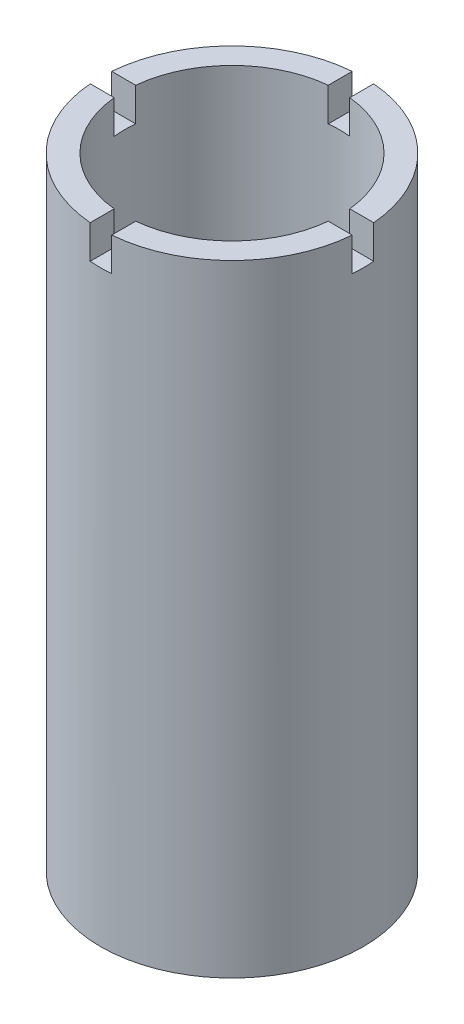
ISO-10303-21;
HEADER;
FILE_DESCRIPTION(('STEP AP214'),'2;1');
FILE_NAME('part.step','',(''),(''),'','','');
FILE_SCHEMA(('AUTOMOTIVE_DESIGN { 1 0 10303 214 1 1 1 1 }'));
ENDSEC;
DATA;
#1=APPLICATION_CONTEXT('core data for automotive mechanical design processes');
#2=APPLICATION_PROTOCOL_DEFINITION('international standard','automotive_design',2000,#1);
#3=PRODUCT_CONTEXT('',#1,'mechanical');
#4=PRODUCT('Part','Part','',(#3));
#5=PRODUCT_RELATED_PRODUCT_CATEGORY('part','',(#4));
#6=PRODUCT_DEFINITION_FORMATION('','',#4);
#7=PRODUCT_DEFINITION_CONTEXT('part definition',#1,'design');
#8=PRODUCT_DEFINITION('design','',#6,#7);
#9=PRODUCT_DEFINITION_SHAPE('','',#8);
#10=(LENGTH_UNIT() NAMED_UNIT(*) SI_UNIT(.MILLI.,.METRE.));
#11=(NAMED_UNIT(*) PLANE_ANGLE_UNIT() SI_UNIT($,.RADIAN.));
#12=(NAMED_UNIT(*) SI_UNIT($,.STERADIAN.) SOLID_ANGLE_UNIT());
#13=UNCERTAINTY_MEASURE_WITH_UNIT(LENGTH_MEASURE(1.E-05),#10,'distance_accuracy_value','');
#14=(GEOMETRIC_REPRESENTATION_CONTEXT(3) GLOBAL_UNCERTAINTY_ASSIGNED_CONTEXT((#13)) GLOBAL_UNIT_ASSIGNED_CONTEXT((#10,
#11,#12)) REPRESENTATION_CONTEXT('',''));
#15=CARTESIAN_POINT('',(0.,0.,0.));
#16=DIRECTION('',(0.,0.,1.));
#17=DIRECTION('',(1.,0.,0.));
#18=AXIS2_PLACEMENT_3D('',#15,#16,#17);
#19=CARTESIAN_POINT('',(0.,130.,0.));
#20=DIRECTION('',(0.,1.,0.));
#21=DIRECTION('',(0.,0.,1.));
#22=AXIS2_PLACEMENT_3D('',#19,#20,#21);
#23=PLANE('',#22);
#24=DIRECTION('',(1.,0.,-3.47163573248831E-13));
#25=VECTOR('',#24,1.);
#26=CARTESIAN_POINT('',(27.4077999846761,130.,2.24999999999811));
#27=LINE('',#26,#25);
#28=CARTESIAN_POINT('',(22.387217334899,130.,2.24999999999985));
#29=VERTEX_POINT('',#28);
#30=CARTESIAN_POINT('',(27.4077999846761,130.,2.24999999999811));
#31=VERTEX_POINT('',#30);
#32=EDGE_CURVE('E173',#29,#31,#27,.T.);
#33=ORIENTED_EDGE('',*,*,#32,.F.);
#34=CARTESIAN_POINT('',(0.,130.,0.));
#35=DIRECTION('',(0.,1.,0.));
#36=DIRECTION('',(0.,0.,1.));
#37=AXIS2_PLACEMENT_3D('',#34,#35,#36);
#38=CIRCLE('',#37,22.5);
#39=CARTESIAN_POINT('',(2.25,130.,22.387217334899));
#40=VERTEX_POINT('',#39);
#41=EDGE_CURVE('E255',#40,#29,#38,.T.);
#42=ORIENTED_EDGE('',*,*,#41,.F.);
#43=DIRECTION('',(0.,0.,-1.));
#44=VECTOR('',#43,1.);
#45=CARTESIAN_POINT('',(2.25,130.,27.4077999846759));
#46=LINE('',#45,#44);
#47=CARTESIAN_POINT('',(2.25,130.,27.4077999846759));
#48=VERTEX_POINT('',#47);
#49=EDGE_CURVE('E196',#48,#40,#46,.T.);
#50=ORIENTED_EDGE('',*,*,#49,.F.);
#51=CARTESIAN_POINT('',(0.,130.,0.));
#52=DIRECTION('',(0.,1.,0.));
#53=DIRECTION('',(0.,0.,1.));
#54=AXIS2_PLACEMENT_3D('',#51,#52,#53);
#55=CIRCLE('',#54,27.5);
#56=EDGE_CURVE('E12',#48,#31,#55,.T.);
#57=ORIENTED_EDGE('',*,*,#56,.T.);
#58=EDGE_LOOP('',(#33,#42,#50,#57));
#59=FACE_BOUND('',#58,.T.);
#60=ADVANCED_FACE('F42',(#59),#23,.T.);
#61=DIRECTION('',(-1.,0.,0.));
#62=VECTOR('',#61,1.);
#63=CARTESIAN_POINT('',(27.4077999846759,130.,-2.25000000000018));
#64=LINE('',#63,#62);
#65=CARTESIAN_POINT('',(27.4077999846759,130.,-2.25000000000018));
#66=VERTEX_POINT('',#65);
#67=CARTESIAN_POINT('',(22.3872173348989,130.,-2.25000000000014));
#68=VERTEX_POINT('',#67);
#69=EDGE_CURVE('E201',#66,#68,#64,.T.);
#70=ORIENTED_EDGE('',*,*,#69,.F.);
#71=CARTESIAN_POINT('',(2.25,130.,-27.4077999846759));
#72=VERTEX_POINT('',#71);
#73=EDGE_CURVE('E51',#66,#72,#55,.T.);
#74=ORIENTED_EDGE('',*,*,#73,.T.);
#75=DIRECTION('',(0.,0.,-1.));
#76=VECTOR('',#75,1.);
#77=CARTESIAN_POINT('',(2.25,130.,-27.4077999846759));
#78=LINE('',#77,#76);
#79=CARTESIAN_POINT('',(2.25,130.,-22.387217334899));
#80=VERTEX_POINT('',#79);
#81=EDGE_CURVE('E195',#80,#72,#78,.T.);
#82=ORIENTED_EDGE('',*,*,#81,.F.);
#83=EDGE_CURVE('E258',#68,#80,#38,.T.);
#84=ORIENTED_EDGE('',*,*,#83,.F.);
#85=EDGE_LOOP('',(#70,#74,#82,#84));
#86=FACE_BOUND('',#85,.T.);
#87=ADVANCED_FACE('F313',(#86),#23,.T.);
#88=DIRECTION('',(0.,0.,1.));
#89=VECTOR('',#88,1.);
#90=CARTESIAN_POINT('',(-2.25,130.,-27.4077999846759));
#91=LINE('',#90,#89);
#92=CARTESIAN_POINT('',(-2.25,130.,-27.4077999846759));
#93=VERTEX_POINT('',#92);
#94=CARTESIAN_POINT('',(-2.25,130.,-22.387217334899));
#95=VERTEX_POINT('',#94);
#96=EDGE_CURVE('E220',#93,#95,#91,.T.);
#97=ORIENTED_EDGE('',*,*,#96,.F.);
#98=CARTESIAN_POINT('',(-27.4077999846759,130.,-2.25));
#99=VERTEX_POINT('',#98);
#100=EDGE_CURVE('E299',#93,#99,#55,.T.);
#101=ORIENTED_EDGE('',*,*,#100,.T.);
#102=DIRECTION('',(-1.,0.,0.));
#103=VECTOR('',#102,1.);
#104=CARTESIAN_POINT('',(-27.4077999846759,130.,-2.25));
#105=LINE('',#104,#103);
#106=CARTESIAN_POINT('',(-22.387217334899,130.,-2.25));
#107=VERTEX_POINT('',#106);
#108=EDGE_CURVE('E219',#107,#99,#105,.T.);
#109=ORIENTED_EDGE('',*,*,#108,.F.);
#110=EDGE_CURVE('E266',#95,#107,#38,.T.);
#111=ORIENTED_EDGE('',*,*,#110,.F.);
#112=EDGE_LOOP('',(#97,#101,#109,#111));
#113=FACE_BOUND('',#112,.T.);
#114=ADVANCED_FACE('F310',(#113),#23,.T.);
#115=DIRECTION('',(0.,0.,1.));
#116=VECTOR('',#115,1.);
#117=CARTESIAN_POINT('',(-2.25,130.,27.4077999846759));
#118=LINE('',#117,#116);
#119=CARTESIAN_POINT('',(-2.25,130.,22.387217334899));
#120=VERTEX_POINT('',#119);
#121=CARTESIAN_POINT('',(-2.25,130.,27.4077999846759));
#122=VERTEX_POINT('',#121);
#123=EDGE_CURVE('E198',#120,#122,#118,.T.);
#124=ORIENTED_EDGE('',*,*,#123,.F.);
#125=CARTESIAN_POINT('',(-22.387217334899,130.,2.25));
#126=VERTEX_POINT('',#125);
#127=EDGE_CURVE('E259',#126,#120,#38,.T.);
#128=ORIENTED_EDGE('',*,*,#127,.F.);
#129=DIRECTION('',(1.,0.,0.));
#130=VECTOR('',#129,1.);
#131=CARTESIAN_POINT('',(-27.4077999846759,130.,2.25));
#132=LINE('',#131,#130);
#133=CARTESIAN_POINT('',(-27.4077999846759,130.,2.25));
#134=VERTEX_POINT('',#133);
#135=EDGE_CURVE('E243',#134,#126,#132,.T.);
#136=ORIENTED_EDGE('',*,*,#135,.F.);
#137=EDGE_CURVE('E52',#134,#122,#55,.T.);
#138=ORIENTED_EDGE('',*,*,#137,.T.);
#139=EDGE_LOOP('',(#124,#128,#136,#138));
#140=FACE_BOUND('',#139,.T.);
#141=ADVANCED_FACE('F297',(#140),#23,.T.);
#142=CARTESIAN_POINT('',(0.,0.,0.));
#143=DIRECTION('',(0.,1.,0.));
#144=DIRECTION('',(0.,0.,1.));
#145=AXIS2_PLACEMENT_3D('',#142,#143,#144);
#146=PLANE('',#145);
#147=CARTESIAN_POINT('',(0.,0.,0.));
#148=DIRECTION('',(0.,1.,0.));
#149=DIRECTION('',(0.,0.,1.));
#150=AXIS2_PLACEMENT_3D('',#147,#148,#149);
#151=CIRCLE('',#150,27.5);
#152=CARTESIAN_POINT('',(0.,0.,27.5));
#153=VERTEX_POINT('',#152);
#154=EDGE_CURVE('E46',#153,#153,#151,.T.);
#155=ORIENTED_EDGE('',*,*,#154,.F.);
#156=EDGE_LOOP('',(#155));
#157=FACE_BOUND('',#156,.T.);
#158=CARTESIAN_POINT('',(0.,0.,0.));
#159=DIRECTION('',(0.,1.,0.));
#160=DIRECTION('',(0.,0.,1.));
#161=AXIS2_PLACEMENT_3D('',#158,#159,#160);
#162=CIRCLE('',#161,22.5);
#163=CARTESIAN_POINT('',(0.,0.,22.5));
#164=VERTEX_POINT('',#163);
#165=EDGE_CURVE('E260',#164,#164,#162,.T.);
#166=ORIENTED_EDGE('',*,*,#165,.T.);
#167=EDGE_LOOP('',(#166));
#168=FACE_BOUND('',#167,.T.);
#169=ADVANCED_FACE('F304',(#157,#168),#146,.F.);
#170=CARTESIAN_POINT('',(0.,130.,0.));
#171=DIRECTION('',(0.,-1.,0.));
#172=DIRECTION('',(0.,0.,-1.));
#173=AXIS2_PLACEMENT_3D('',#170,#171,#172);
#174=CYLINDRICAL_SURFACE('',#173,27.5);
#175=CARTESIAN_POINT('',(0.,123.,0.));
#176=DIRECTION('',(0.,1.,0.));
#177=DIRECTION('',(0.,0.,1.));
#178=AXIS2_PLACEMENT_3D('',#175,#176,#177);
#179=CIRCLE('',#178,27.5);
#180=CARTESIAN_POINT('',(27.4077999846761,123.,2.24999999999811));
#181=VERTEX_POINT('',#180);
#182=CARTESIAN_POINT('',(27.4077999846759,123.,-2.25000000000018));
#183=VERTEX_POINT('',#182);
#184=EDGE_CURVE('E164',#181,#183,#179,.T.);
#185=ORIENTED_EDGE('',*,*,#184,.F.);
#186=DIRECTION('',(0.,1.,0.));
#187=VECTOR('',#186,1.);
#188=CARTESIAN_POINT('',(27.4077999846761,123.,2.24999999999811));
#189=LINE('',#188,#187);
#190=EDGE_CURVE('E262',#181,#31,#189,.T.);
#191=ORIENTED_EDGE('',*,*,#190,.T.);
#192=ORIENTED_EDGE('',*,*,#56,.F.);
#193=DIRECTION('',(0.,1.,0.));
#194=VECTOR('',#193,1.);
#195=CARTESIAN_POINT('',(2.25,123.,27.4077999846759));
#196=LINE('',#195,#194);
#197=CARTESIAN_POINT('',(2.25,123.,27.4077999846759));
#198=VERTEX_POINT('',#197);
#199=EDGE_CURVE('E190',#198,#48,#196,.T.);
#200=ORIENTED_EDGE('',*,*,#199,.F.);
#201=CARTESIAN_POINT('',(0.,123.,0.));
#202=DIRECTION('',(0.,1.,0.));
#203=DIRECTION('',(0.,0.,1.));
#204=AXIS2_PLACEMENT_3D('',#201,#202,#203);
#205=CIRCLE('',#204,27.5);
#206=CARTESIAN_POINT('',(-2.25,123.,27.4077999846759));
#207=VERTEX_POINT('',#206);
#208=EDGE_CURVE('E203',#207,#198,#205,.T.);
#209=ORIENTED_EDGE('',*,*,#208,.F.);
#210=DIRECTION('',(0.,1.,0.));
#211=VECTOR('',#210,1.);
#212=CARTESIAN_POINT('',(-2.25,123.,27.4077999846759));
#213=LINE('',#212,#211);
#214=EDGE_CURVE('E187',#207,#122,#213,.T.);
#215=ORIENTED_EDGE('',*,*,#214,.T.);
#216=ORIENTED_EDGE('',*,*,#137,.F.);
#217=DIRECTION('',(0.,1.,0.));
#218=VECTOR('',#217,1.);
#219=CARTESIAN_POINT('',(-27.4077999846759,123.,2.25));
#220=LINE('',#219,#218);
#221=CARTESIAN_POINT('',(-27.4077999846759,123.,2.25));
#222=VERTEX_POINT('',#221);
#223=EDGE_CURVE('E238',#222,#134,#220,.T.);
#224=ORIENTED_EDGE('',*,*,#223,.F.);
#225=CARTESIAN_POINT('',(0.,123.,0.));
#226=DIRECTION('',(0.,1.,0.));
#227=DIRECTION('',(0.,0.,1.));
#228=AXIS2_PLACEMENT_3D('',#225,#226,#227);
#229=CIRCLE('',#228,27.5);
#230=CARTESIAN_POINT('',(-27.4077999846759,123.,-2.25));
#231=VERTEX_POINT('',#230);
#232=EDGE_CURVE('E248',#231,#222,#229,.T.);
#233=ORIENTED_EDGE('',*,*,#232,.F.);
#234=DIRECTION('',(0.,1.,0.));
#235=VECTOR('',#234,1.);
#236=CARTESIAN_POINT('',(-27.4077999846759,123.,-2.25));
#237=LINE('',#236,#235);
#238=EDGE_CURVE('E235',#231,#99,#237,.T.);
#239=ORIENTED_EDGE('',*,*,#238,.T.);
#240=ORIENTED_EDGE('',*,*,#100,.F.);
#241=DIRECTION('',(0.,1.,0.));
#242=VECTOR('',#241,1.);
#243=CARTESIAN_POINT('',(-2.25,123.,-27.4077999846759));
#244=LINE('',#243,#242);
#245=CARTESIAN_POINT('',(-2.25,123.,-27.4077999846759));
#246=VERTEX_POINT('',#245);
#247=EDGE_CURVE('E214',#246,#93,#244,.T.);
#248=ORIENTED_EDGE('',*,*,#247,.F.);
#249=CARTESIAN_POINT('',(0.,123.,0.));
#250=DIRECTION('',(0.,1.,0.));
#251=DIRECTION('',(0.,0.,1.));
#252=AXIS2_PLACEMENT_3D('',#249,#250,#251);
#253=CIRCLE('',#252,27.5);
#254=CARTESIAN_POINT('',(2.25,123.,-27.4077999846759));
#255=VERTEX_POINT('',#254);
#256=EDGE_CURVE('E225',#255,#246,#253,.T.);
#257=ORIENTED_EDGE('',*,*,#256,.F.);
#258=DIRECTION('',(0.,1.,0.));
#259=VECTOR('',#258,1.);
#260=CARTESIAN_POINT('',(2.25,123.,-27.4077999846759));
#261=LINE('',#260,#259);
#262=EDGE_CURVE('E212',#255,#72,#261,.T.);
#263=ORIENTED_EDGE('',*,*,#262,.T.);
#264=ORIENTED_EDGE('',*,*,#73,.F.);
#265=DIRECTION('',(0.,1.,0.));
#266=VECTOR('',#265,1.);
#267=CARTESIAN_POINT('',(27.4077999846759,123.,-2.25000000000018));
#268=LINE('',#267,#266);
#269=EDGE_CURVE('E158',#183,#66,#268,.T.);
#270=ORIENTED_EDGE('',*,*,#269,.F.);
#271=EDGE_LOOP('',(#185,#191,#192,#200,#209,#215,#216,#224,#233,#239,#240,#248,#257,#263,#264,#270));
#272=FACE_BOUND('',#271,.T.);
#273=ORIENTED_EDGE('',*,*,#154,.T.);
#274=EDGE_LOOP('',(#273));
#275=FACE_BOUND('',#274,.T.);
#276=ADVANCED_FACE('F44',(#272,#275),#174,.T.);
#277=CARTESIAN_POINT('',(0.,130.,0.));
#278=DIRECTION('',(0.,-1.,0.));
#279=DIRECTION('',(0.,0.,-1.));
#280=AXIS2_PLACEMENT_3D('',#277,#278,#279);
#281=CYLINDRICAL_SURFACE('',#280,22.5);
#282=DIRECTION('',(0.,1.,0.));
#283=VECTOR('',#282,1.);
#284=CARTESIAN_POINT('',(22.387217334899,123.,2.24999999999985));
#285=LINE('',#284,#283);
#286=CARTESIAN_POINT('',(22.387217334899,123.,2.24999999999985));
#287=VERTEX_POINT('',#286);
#288=EDGE_CURVE('E180',#287,#29,#285,.T.);
#289=ORIENTED_EDGE('',*,*,#288,.F.);
#290=CARTESIAN_POINT('',(0.,123.,0.));
#291=DIRECTION('',(0.,-1.,0.));
#292=DIRECTION('',(0.,0.,1.));
#293=AXIS2_PLACEMENT_3D('',#290,#291,#292);
#294=CIRCLE('',#293,22.5);
#295=CARTESIAN_POINT('',(22.3872173348989,123.,-2.25000000000014));
#296=VERTEX_POINT('',#295);
#297=EDGE_CURVE('E163',#296,#287,#294,.T.);
#298=ORIENTED_EDGE('',*,*,#297,.F.);
#299=DIRECTION('',(0.,1.,0.));
#300=VECTOR('',#299,1.);
#301=CARTESIAN_POINT('',(22.3872173348989,123.,-2.25000000000014));
#302=LINE('',#301,#300);
#303=EDGE_CURVE('E161',#296,#68,#302,.T.);
#304=ORIENTED_EDGE('',*,*,#303,.T.);
#305=ORIENTED_EDGE('',*,*,#83,.T.);
#306=DIRECTION('',(0.,1.,0.));
#307=VECTOR('',#306,1.);
#308=CARTESIAN_POINT('',(2.25,123.,-22.387217334899));
#309=LINE('',#308,#307);
#310=CARTESIAN_POINT('',(2.25,123.,-22.387217334899));
#311=VERTEX_POINT('',#310);
#312=EDGE_CURVE('E209',#311,#80,#309,.T.);
#313=ORIENTED_EDGE('',*,*,#312,.F.);
#314=CARTESIAN_POINT('',(0.,123.,0.));
#315=DIRECTION('',(0.,-1.,0.));
#316=DIRECTION('',(0.,0.,1.));
#317=AXIS2_PLACEMENT_3D('',#314,#315,#316);
#318=CIRCLE('',#317,22.5);
#319=CARTESIAN_POINT('',(-2.25,123.,-22.387217334899));
#320=VERTEX_POINT('',#319);
#321=EDGE_CURVE('E222',#320,#311,#318,.T.);
#322=ORIENTED_EDGE('',*,*,#321,.F.);
#323=DIRECTION('',(0.,1.,0.));
#324=VECTOR('',#323,1.);
#325=CARTESIAN_POINT('',(-2.25,123.,-22.387217334899));
#326=LINE('',#325,#324);
#327=EDGE_CURVE('E216',#320,#95,#326,.T.);
#328=ORIENTED_EDGE('',*,*,#327,.T.);
#329=ORIENTED_EDGE('',*,*,#110,.T.);
#330=DIRECTION('',(0.,1.,0.));
#331=VECTOR('',#330,1.);
#332=CARTESIAN_POINT('',(-22.387217334899,123.,-2.25));
#333=LINE('',#332,#331);
#334=CARTESIAN_POINT('',(-22.387217334899,123.,-2.25));
#335=VERTEX_POINT('',#334);
#336=EDGE_CURVE('E232',#335,#107,#333,.T.);
#337=ORIENTED_EDGE('',*,*,#336,.F.);
#338=CARTESIAN_POINT('',(0.,123.,0.));
#339=DIRECTION('',(0.,-1.,0.));
#340=DIRECTION('',(0.,0.,1.));
#341=AXIS2_PLACEMENT_3D('',#338,#339,#340);
#342=CIRCLE('',#341,22.5);
#343=CARTESIAN_POINT('',(-22.387217334899,123.,2.25));
#344=VERTEX_POINT('',#343);
#345=EDGE_CURVE('E245',#344,#335,#342,.T.);
#346=ORIENTED_EDGE('',*,*,#345,.F.);
#347=DIRECTION('',(0.,1.,0.));
#348=VECTOR('',#347,1.);
#349=CARTESIAN_POINT('',(-22.387217334899,123.,2.25));
#350=LINE('',#349,#348);
#351=EDGE_CURVE('E240',#344,#126,#350,.T.);
#352=ORIENTED_EDGE('',*,*,#351,.T.);
#353=ORIENTED_EDGE('',*,*,#127,.T.);
#354=DIRECTION('',(0.,1.,0.));
#355=VECTOR('',#354,1.);
#356=CARTESIAN_POINT('',(-2.25,123.,22.387217334899));
#357=LINE('',#356,#355);
#358=CARTESIAN_POINT('',(-2.25,123.,22.387217334899));
#359=VERTEX_POINT('',#358);
#360=EDGE_CURVE('E185',#359,#120,#357,.T.);
#361=ORIENTED_EDGE('',*,*,#360,.F.);
#362=CARTESIAN_POINT('',(0.,123.,0.));
#363=DIRECTION('',(0.,-1.,0.));
#364=DIRECTION('',(0.,0.,1.));
#365=AXIS2_PLACEMENT_3D('',#362,#363,#364);
#366=CIRCLE('',#365,22.5);
#367=CARTESIAN_POINT('',(2.25,123.,22.387217334899));
#368=VERTEX_POINT('',#367);
#369=EDGE_CURVE('E199',#368,#359,#366,.T.);
#370=ORIENTED_EDGE('',*,*,#369,.F.);
#371=DIRECTION('',(0.,1.,0.));
#372=VECTOR('',#371,1.);
#373=CARTESIAN_POINT('',(2.25,123.,22.387217334899));
#374=LINE('',#373,#372);
#375=EDGE_CURVE('E192',#368,#40,#374,.T.);
#376=ORIENTED_EDGE('',*,*,#375,.T.);
#377=ORIENTED_EDGE('',*,*,#41,.T.);
#378=EDGE_LOOP('',(#289,#298,#304,#305,#313,#322,#328,#329,#337,#346,#352,#353,#361,#370,#376,#377));
#379=FACE_BOUND('',#378,.T.);
#380=ORIENTED_EDGE('',*,*,#165,.F.);
#381=EDGE_LOOP('',(#380));
#382=FACE_BOUND('',#381,.T.);
#383=ADVANCED_FACE('F277',(#379,#382),#281,.F.);
#384=CARTESIAN_POINT('',(-27.4077999846759,123.,2.25));
#385=DIRECTION('',(0.,0.,1.));
#386=DIRECTION('',(1.,0.,0.));
#387=AXIS2_PLACEMENT_3D('',#384,#385,#386);
#388=PLANE('',#387);
#389=ORIENTED_EDGE('',*,*,#135,.T.);
#390=ORIENTED_EDGE('',*,*,#351,.F.);
#391=DIRECTION('',(1.,0.,0.));
#392=VECTOR('',#391,1.);
#393=CARTESIAN_POINT('',(-27.4077999846759,123.,2.25));
#394=LINE('',#393,#392);
#395=EDGE_CURVE('E234',#222,#344,#394,.T.);
#396=ORIENTED_EDGE('',*,*,#395,.F.);
#397=ORIENTED_EDGE('',*,*,#223,.T.);
#398=EDGE_LOOP('',(#389,#390,#396,#397));
#399=FACE_BOUND('',#398,.T.);
#400=ADVANCED_FACE('F321',(#399),#388,.F.);
#401=CARTESIAN_POINT('',(-27.4077999846759,123.,-2.25));
#402=DIRECTION('',(0.,0.,-1.));
#403=DIRECTION('',(-1.,0.,0.));
#404=AXIS2_PLACEMENT_3D('',#401,#402,#403);
#405=PLANE('',#404);
#406=ORIENTED_EDGE('',*,*,#108,.T.);
#407=ORIENTED_EDGE('',*,*,#238,.F.);
#408=DIRECTION('',(-1.,0.,0.));
#409=VECTOR('',#408,1.);
#410=CARTESIAN_POINT('',(-27.4077999846759,123.,-2.25));
#411=LINE('',#410,#409);
#412=EDGE_CURVE('E250',#335,#231,#411,.T.);
#413=ORIENTED_EDGE('',*,*,#412,.F.);
#414=ORIENTED_EDGE('',*,*,#336,.T.);
#415=EDGE_LOOP('',(#406,#407,#413,#414));
#416=FACE_BOUND('',#415,.T.);
#417=ADVANCED_FACE('F326',(#416),#405,.F.);
#418=CARTESIAN_POINT('',(0.,123.,0.));
#419=DIRECTION('',(0.,1.,0.));
#420=DIRECTION('',(0.,0.,1.));
#421=AXIS2_PLACEMENT_3D('',#418,#419,#420);
#422=PLANE('',#421);
#423=ORIENTED_EDGE('',*,*,#345,.T.);
#424=ORIENTED_EDGE('',*,*,#412,.T.);
#425=ORIENTED_EDGE('',*,*,#232,.T.);
#426=ORIENTED_EDGE('',*,*,#395,.T.);
#427=EDGE_LOOP('',(#423,#424,#425,#426));
#428=FACE_BOUND('',#427,.T.);
#429=ADVANCED_FACE('F322',(#428),#422,.T.);
#430=CARTESIAN_POINT('',(-2.25,123.,-27.4077999846759));
#431=DIRECTION('',(-1.,0.,0.));
#432=DIRECTION('',(0.,0.,1.));
#433=AXIS2_PLACEMENT_3D('',#430,#431,#432);
#434=PLANE('',#433);
#435=ORIENTED_EDGE('',*,*,#96,.T.);
#436=ORIENTED_EDGE('',*,*,#327,.F.);
#437=DIRECTION('',(0.,0.,1.));
#438=VECTOR('',#437,1.);
#439=CARTESIAN_POINT('',(-2.25,123.,-27.4077999846759));
#440=LINE('',#439,#438);
#441=EDGE_CURVE('E211',#246,#320,#440,.T.);
#442=ORIENTED_EDGE('',*,*,#441,.F.);
#443=ORIENTED_EDGE('',*,*,#247,.T.);
#444=EDGE_LOOP('',(#435,#436,#442,#443));
#445=FACE_BOUND('',#444,.T.);
#446=ADVANCED_FACE('F325',(#445),#434,.F.);
#447=CARTESIAN_POINT('',(2.25,123.,-27.4077999846759));
#448=DIRECTION('',(1.,0.,0.));
#449=DIRECTION('',(0.,0.,-1.));
#450=AXIS2_PLACEMENT_3D('',#447,#448,#449);
#451=PLANE('',#450);
#452=ORIENTED_EDGE('',*,*,#81,.T.);
#453=ORIENTED_EDGE('',*,*,#262,.F.);
#454=DIRECTION('',(0.,0.,-1.));
#455=VECTOR('',#454,1.);
#456=CARTESIAN_POINT('',(2.25,123.,-27.4077999846759));
#457=LINE('',#456,#455);
#458=EDGE_CURVE('E227',#311,#255,#457,.T.);
#459=ORIENTED_EDGE('',*,*,#458,.F.);
#460=ORIENTED_EDGE('',*,*,#312,.T.);
#461=EDGE_LOOP('',(#452,#453,#459,#460));
#462=FACE_BOUND('',#461,.T.);
#463=ADVANCED_FACE('F337',(#462),#451,.F.);
#464=CARTESIAN_POINT('',(0.,123.,0.));
#465=DIRECTION('',(0.,1.,0.));
#466=DIRECTION('',(0.,0.,1.));
#467=AXIS2_PLACEMENT_3D('',#464,#465,#466);
#468=PLANE('',#467);
#469=ORIENTED_EDGE('',*,*,#321,.T.);
#470=ORIENTED_EDGE('',*,*,#458,.T.);
#471=ORIENTED_EDGE('',*,*,#256,.T.);
#472=ORIENTED_EDGE('',*,*,#441,.T.);
#473=EDGE_LOOP('',(#469,#470,#471,#472));
#474=FACE_BOUND('',#473,.T.);
#475=ADVANCED_FACE('F334',(#474),#468,.T.);
#476=CARTESIAN_POINT('',(2.25,123.,27.4077999846759));
#477=DIRECTION('',(1.,0.,0.));
#478=DIRECTION('',(0.,0.,-1.));
#479=AXIS2_PLACEMENT_3D('',#476,#477,#478);
#480=PLANE('',#479);
#481=ORIENTED_EDGE('',*,*,#49,.T.);
#482=ORIENTED_EDGE('',*,*,#375,.F.);
#483=DIRECTION('',(0.,0.,-1.));
#484=VECTOR('',#483,1.);
#485=CARTESIAN_POINT('',(2.25,123.,27.4077999846759));
#486=LINE('',#485,#484);
#487=EDGE_CURVE('E67',#198,#368,#486,.T.);
#488=ORIENTED_EDGE('',*,*,#487,.F.);
#489=ORIENTED_EDGE('',*,*,#199,.T.);
#490=EDGE_LOOP('',(#481,#482,#488,#489));
#491=FACE_BOUND('',#490,.T.);
#492=ADVANCED_FACE('F286',(#491),#480,.F.);
#493=CARTESIAN_POINT('',(-2.25,123.,27.4077999846759));
#494=DIRECTION('',(-1.,0.,0.));
#495=DIRECTION('',(0.,0.,1.));
#496=AXIS2_PLACEMENT_3D('',#493,#494,#495);
#497=PLANE('',#496);
#498=ORIENTED_EDGE('',*,*,#123,.T.);
#499=ORIENTED_EDGE('',*,*,#214,.F.);
#500=DIRECTION('',(0.,0.,1.));
#501=VECTOR('',#500,1.);
#502=CARTESIAN_POINT('',(-2.25,123.,27.4077999846759));
#503=LINE('',#502,#501);
#504=EDGE_CURVE('E205',#359,#207,#503,.T.);
#505=ORIENTED_EDGE('',*,*,#504,.F.);
#506=ORIENTED_EDGE('',*,*,#360,.T.);
#507=EDGE_LOOP('',(#498,#499,#505,#506));
#508=FACE_BOUND('',#507,.T.);
#509=ADVANCED_FACE('F290',(#508),#497,.F.);
#510=CARTESIAN_POINT('',(0.,123.,0.));
#511=DIRECTION('',(0.,1.,0.));
#512=DIRECTION('',(0.,0.,1.));
#513=AXIS2_PLACEMENT_3D('',#510,#511,#512);
#514=PLANE('',#513);
#515=ORIENTED_EDGE('',*,*,#369,.T.);
#516=ORIENTED_EDGE('',*,*,#504,.T.);
#517=ORIENTED_EDGE('',*,*,#208,.T.);
#518=ORIENTED_EDGE('',*,*,#487,.T.);
#519=EDGE_LOOP('',(#515,#516,#517,#518));
#520=FACE_BOUND('',#519,.T.);
#521=ADVANCED_FACE('F288',(#520),#514,.T.);
#522=CARTESIAN_POINT('',(27.4077999846761,123.,2.24999999999811));
#523=DIRECTION('',(3.47163573248831E-13,0.,1.));
#524=DIRECTION('',(1.,0.,-3.47163573248831E-13));
#525=AXIS2_PLACEMENT_3D('',#522,#523,#524);
#526=PLANE('',#525);
#527=ORIENTED_EDGE('',*,*,#32,.T.);
#528=ORIENTED_EDGE('',*,*,#190,.F.);
#529=DIRECTION('',(1.,0.,-3.47163573248831E-13));
#530=VECTOR('',#529,1.);
#531=CARTESIAN_POINT('',(27.4077999846761,123.,2.24999999999811));
#532=LINE('',#531,#530);
#533=EDGE_CURVE('E170',#287,#181,#532,.T.);
#534=ORIENTED_EDGE('',*,*,#533,.F.);
#535=ORIENTED_EDGE('',*,*,#288,.T.);
#536=EDGE_LOOP('',(#527,#528,#534,#535));
#537=FACE_BOUND('',#536,.T.);
#538=ADVANCED_FACE('F275',(#537),#526,.F.);
#539=CARTESIAN_POINT('',(27.4077999846759,123.,-2.25000000000018));
#540=DIRECTION('',(0.,0.,-1.));
#541=DIRECTION('',(-1.,0.,0.));
#542=AXIS2_PLACEMENT_3D('',#539,#540,#541);
#543=PLANE('',#542);
#544=ORIENTED_EDGE('',*,*,#69,.T.);
#545=ORIENTED_EDGE('',*,*,#303,.F.);
#546=DIRECTION('',(-1.,0.,0.));
#547=VECTOR('',#546,1.);
#548=CARTESIAN_POINT('',(27.4077999846759,123.,-2.25000000000018));
#549=LINE('',#548,#547);
#550=EDGE_CURVE('E59',#183,#296,#549,.T.);
#551=ORIENTED_EDGE('',*,*,#550,.F.);
#552=ORIENTED_EDGE('',*,*,#269,.T.);
#553=EDGE_LOOP('',(#544,#545,#551,#552));
#554=FACE_BOUND('',#553,.T.);
#555=ADVANCED_FACE('F156',(#554),#543,.F.);
#556=CARTESIAN_POINT('',(0.,123.,0.));
#557=DIRECTION('',(0.,1.,0.));
#558=DIRECTION('',(0.,0.,1.));
#559=AXIS2_PLACEMENT_3D('',#556,#557,#558);
#560=PLANE('',#559);
#561=ORIENTED_EDGE('',*,*,#184,.T.);
#562=ORIENTED_EDGE('',*,*,#550,.T.);
#563=ORIENTED_EDGE('',*,*,#297,.T.);
#564=ORIENTED_EDGE('',*,*,#533,.T.);
#565=EDGE_LOOP('',(#561,#562,#563,#564));
#566=FACE_BOUND('',#565,.T.);
#567=ADVANCED_FACE('F168',(#566),#560,.T.);
#568=CLOSED_SHELL('',(#60,#87,#114,#141,#169,#276,#383,#400,#417,#429,#446,#463,#475,#492,#509,
#521,#538,#555,#567));
#569=MANIFOLD_SOLID_BREP('B2',#568);
#570=ADVANCED_BREP_SHAPE_REPRESENTATION('',(#18,#569),#14);
#571=SHAPE_DEFINITION_REPRESENTATION(#9,#570);
ENDSEC;
END-ISO-10303-21;
